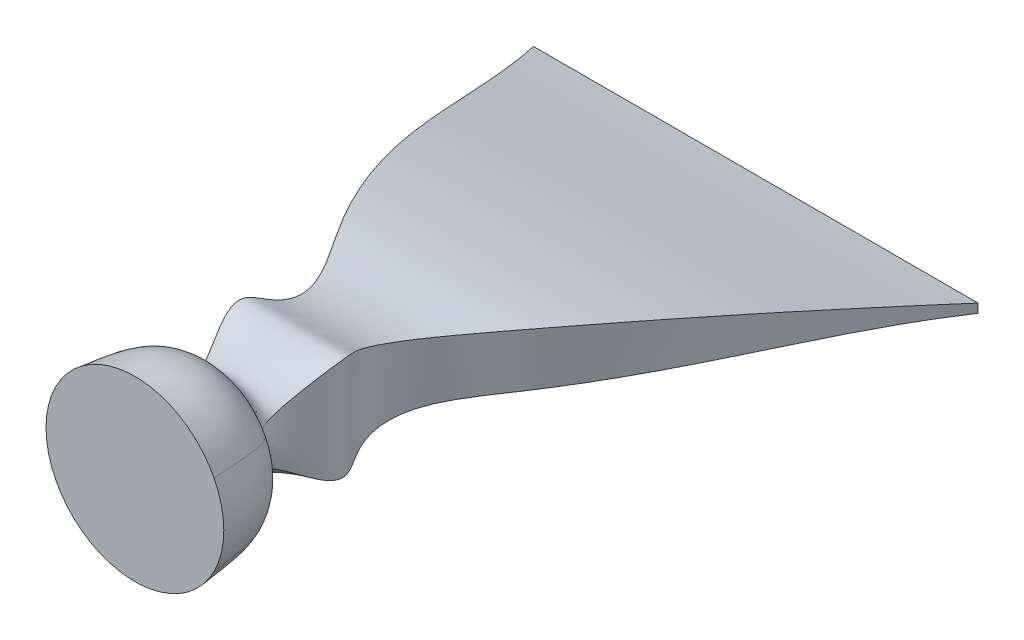
ISO-10303-21;
HEADER;
FILE_DESCRIPTION(('STEP AP214'),'2;1');
FILE_NAME('part.step','',(''),(''),'','','');
FILE_SCHEMA(('AUTOMOTIVE_DESIGN { 1 0 10303 214 1 1 1 1 }'));
ENDSEC;
DATA;
#1=APPLICATION_CONTEXT('core data for automotive mechanical design processes');
#2=APPLICATION_PROTOCOL_DEFINITION('international standard','automotive_design',2000,#1);
#3=PRODUCT_CONTEXT('',#1,'mechanical');
#4=PRODUCT('Part','Part','',(#3));
#5=PRODUCT_RELATED_PRODUCT_CATEGORY('part','',(#4));
#6=PRODUCT_DEFINITION_FORMATION('','',#4);
#7=PRODUCT_DEFINITION_CONTEXT('part definition',#1,'design');
#8=PRODUCT_DEFINITION('design','',#6,#7);
#9=PRODUCT_DEFINITION_SHAPE('','',#8);
#10=(LENGTH_UNIT() NAMED_UNIT(*) SI_UNIT(.MILLI.,.METRE.));
#11=(NAMED_UNIT(*) PLANE_ANGLE_UNIT() SI_UNIT($,.RADIAN.));
#12=(NAMED_UNIT(*) SI_UNIT($,.STERADIAN.) SOLID_ANGLE_UNIT());
#13=UNCERTAINTY_MEASURE_WITH_UNIT(LENGTH_MEASURE(1.E-05),#10,'distance_accuracy_value','');
#14=(GEOMETRIC_REPRESENTATION_CONTEXT(3) GLOBAL_UNCERTAINTY_ASSIGNED_CONTEXT((#13)) GLOBAL_UNIT_ASSIGNED_CONTEXT((#10,
#11,#12)) REPRESENTATION_CONTEXT('',''));
#15=CARTESIAN_POINT('',(0.,0.,0.));
#16=DIRECTION('',(0.,0.,1.));
#17=DIRECTION('',(1.,0.,0.));
#18=AXIS2_PLACEMENT_3D('',#15,#16,#17);
#19=CARTESIAN_POINT('',(0.,0.,700.));
#20=DIRECTION('',(0.,0.,1.));
#21=DIRECTION('',(1.,0.,0.));
#22=AXIS2_PLACEMENT_3D('',#19,#20,#21);
#23=PLANE('',#22);
#24=CARTESIAN_POINT('',(0.,0.,700.));
#25=DIRECTION('',(0.,0.,1.));
#26=DIRECTION('',(1.,0.,0.));
#27=AXIS2_PLACEMENT_3D('',#24,#25,#26);
#28=CIRCLE('',#27,100.);
#29=CARTESIAN_POINT('',(89.0953743978399,45.4094071851719,700.));
#30=VERTEX_POINT('',#29);
#31=CARTESIAN_POINT('',(-89.0953743978399,45.4094071851719,700.));
#32=VERTEX_POINT('',#31);
#33=EDGE_CURVE('E12',#30,#32,#28,.T.);
#34=ORIENTED_EDGE('',*,*,#33,.T.);
#35=CARTESIAN_POINT('',(-89.0953743978399,-45.4094071851719,700.));
#36=VERTEX_POINT('',#35);
#37=EDGE_CURVE('E161',#32,#36,#28,.T.);
#38=ORIENTED_EDGE('',*,*,#37,.T.);
#39=CARTESIAN_POINT('',(89.0953743978399,-45.4094071851719,700.));
#40=VERTEX_POINT('',#39);
#41=EDGE_CURVE('E271',#36,#40,#28,.T.);
#42=ORIENTED_EDGE('',*,*,#41,.T.);
#43=EDGE_CURVE('E264',#40,#30,#28,.T.);
#44=ORIENTED_EDGE('',*,*,#43,.T.);
#45=EDGE_LOOP('',(#34,#38,#42,#44));
#46=FACE_BOUND('',#45,.T.);
#47=ADVANCED_FACE('F151',(#46),#23,.T.);
#48=CARTESIAN_POINT('',(0.,0.,0.));
#49=DIRECTION('',(0.,0.,1.));
#50=DIRECTION('',(1.,0.,0.));
#51=AXIS2_PLACEMENT_3D('',#48,#49,#50);
#52=PLANE('',#51);
#53=DIRECTION('',(0.,1.,0.));
#54=VECTOR('',#53,1.);
#55=CARTESIAN_POINT('',(248.395230206912,-54.3960846774782,0.));
#56=LINE('',#55,#54);
#57=CARTESIAN_POINT('',(248.395230206912,-64.3960846774782,0.));
#58=VERTEX_POINT('',#57);
#59=CARTESIAN_POINT('',(248.395230206912,-54.3960846774782,0.));
#60=VERTEX_POINT('',#59);
#61=EDGE_CURVE('E259',#58,#60,#56,.T.);
#62=ORIENTED_EDGE('',*,*,#61,.F.);
#63=DIRECTION('',(1.,0.,0.));
#64=VECTOR('',#63,1.);
#65=CARTESIAN_POINT('',(-251.604769793088,-64.3960846774782,0.));
#66=LINE('',#65,#64);
#67=CARTESIAN_POINT('',(-251.604769793088,-64.3960846774782,0.));
#68=VERTEX_POINT('',#67);
#69=EDGE_CURVE('E218',#68,#58,#66,.T.);
#70=ORIENTED_EDGE('',*,*,#69,.F.);
#71=DIRECTION('',(0.,-1.,0.));
#72=VECTOR('',#71,1.);
#73=CARTESIAN_POINT('',(-251.604769793088,-54.3960846774782,0.));
#74=LINE('',#73,#72);
#75=CARTESIAN_POINT('',(-251.604769793088,-54.3960846774782,0.));
#76=VERTEX_POINT('',#75);
#77=EDGE_CURVE('E197',#76,#68,#74,.T.);
#78=ORIENTED_EDGE('',*,*,#77,.F.);
#79=DIRECTION('',(-1.,0.,0.));
#80=VECTOR('',#79,1.);
#81=CARTESIAN_POINT('',(-251.604769793088,-54.3960846774782,0.));
#82=LINE('',#81,#80);
#83=EDGE_CURVE('E203',#60,#76,#82,.T.);
#84=ORIENTED_EDGE('',*,*,#83,.F.);
#85=EDGE_LOOP('',(#62,#70,#78,#84));
#86=FACE_BOUND('',#85,.T.);
#87=ADVANCED_FACE('F217',(#86),#52,.F.);
#88=CARTESIAN_POINT('',(-251.604769793088,-54.3960846774782,0.));
#89=CARTESIAN_POINT('',(-200.538890917983,-24.0253562791996,122.651823900444));
#90=CARTESIAN_POINT('',(-176.69030179803,38.0187738864658,285.340528787873));
#91=CARTESIAN_POINT('',(-28.6581228979743,30.6660852907135,465.923919914138));
#92=CARTESIAN_POINT('',(-70.7915343498474,70.2458806099714,537.837217750563));
#93=CARTESIAN_POINT('',(-21.5246506386432,6.45099398641753,593.379747816675));
#94=CARTESIAN_POINT('',(-86.6833725542553,46.3880034508124,626.684395937186));
#95=CARTESIAN_POINT('',(-85.2345748406001,43.4416662071478,671.333333333333));
#96=CARTESIAN_POINT('',(-89.0953743978399,45.4094071851719,700.));
#97=CARTESIAN_POINT('',(-251.604769793088,-57.7294180108116,0.));
#98=CARTESIAN_POINT('',(-200.511151235237,-31.0269293373649,122.720621089058));
#99=CARTESIAN_POINT('',(-176.189787029214,16.4871557380077,285.328947273771));
#100=CARTESIAN_POINT('',(-29.0446100759519,10.2015147340967,465.92412019518));
#101=CARTESIAN_POINT('',(-70.3950520269297,23.3941875551825,537.837138285911));
#102=CARTESIAN_POINT('',(-26.6664986767681,2.76528762873666,593.379758328522));
#103=CARTESIAN_POINT('',(-99.9541435947277,17.0606235710791,626.684390801817));
#104=CARTESIAN_POINT('',(-99.772594673202,16.2292206872315,671.333333333333));
#105=CARTESIAN_POINT('',(-103.633394230442,16.8851343465728,700.));
#106=CARTESIAN_POINT('',(-251.604769793088,-61.0627513441449,0.));
#107=CARTESIAN_POINT('',(-200.483411552491,-38.0285023955303,122.789418277672));
#108=CARTESIAN_POINT('',(-176.194456806182,-4.86216825598589,285.317365759669));
#109=CARTESIAN_POINT('',(-29.044529320725,-10.4025475688819,465.924320476223));
#110=CARTESIAN_POINT('',(-70.3950840678358,-23.3144246170077,537.837058821258));
#111=CARTESIAN_POINT('',(-26.6664944382913,-2.77583893323178,593.379768840368));
#112=CARTESIAN_POINT('',(-99.9541456653573,-17.0554689259199,626.684385666449));
#113=CARTESIAN_POINT('',(-99.772594673202,-16.2292206872314,671.333333333333));
#114=CARTESIAN_POINT('',(-103.633394230442,-16.8851343465728,700.));
#115=CARTESIAN_POINT('',(-251.604769793088,-64.3960846774782,0.));
#116=CARTESIAN_POINT('',(-200.455671869745,-45.0300754536956,122.858215466287));
#117=CARTESIAN_POINT('',(-176.704311128937,-26.3937864044439,285.305784245566));
#118=CARTESIAN_POINT('',(-28.6578806322936,-30.8671181254987,465.924520757266));
#119=CARTESIAN_POINT('',(-70.7916304725655,-70.1661176717967,537.836979356605));
#120=CARTESIAN_POINT('',(-21.524637923213,-6.46154529091265,593.379779352214));
#121=CARTESIAN_POINT('',(-86.6833787661441,-46.3828488056532,626.68438053108));
#122=CARTESIAN_POINT('',(-85.2345748406001,-43.4416662071478,671.333333333333));
#123=CARTESIAN_POINT('',(-89.0953743978399,-45.4094071851719,700.));
#124=B_SPLINE_SURFACE_WITH_KNOTS('',3,3,((#88,#89,#90,#91,#92,#93,#94,#95,#96),(#97,#98,#99,
#100,#101,#102,#103,#104,#105),(#106,#107,#108,#109,#110,#111,#112,#113,#114),(#115,#116,#117,
#118,#119,#120,#121,#122,#123)),.UNSPECIFIED.,.F.,.F.,.F.,(4,4),(4,1,1,1,1,1,4),(0.,1.),(0.,
0.52434860753842,0.706694064419427,0.735740670910827,0.847013598208506,0.889298989492965,1.),.UNSPECIFIED.);
#125=CARTESIAN_POINT('',(-251.604769793088,-64.3960846774782,0.));
#126=CARTESIAN_POINT('',(-200.455671869745,-45.0300754536956,122.858215466287));
#127=CARTESIAN_POINT('',(-176.704311128937,-26.3937864044439,285.305784245566));
#128=CARTESIAN_POINT('',(-28.6578806322936,-30.8671181254987,465.924520757266));
#129=CARTESIAN_POINT('',(-70.7916304725655,-70.1661176717967,537.836979356605));
#130=CARTESIAN_POINT('',(-21.524637923213,-6.46154529091265,593.379779352214));
#131=CARTESIAN_POINT('',(-86.6833787661441,-46.3828488056532,626.68438053108));
#132=CARTESIAN_POINT('',(-85.2345748406001,-43.4416662071478,671.333333333333));
#133=CARTESIAN_POINT('',(-89.0953743978399,-45.4094071851719,700.));
#134=B_SPLINE_CURVE_WITH_KNOTS('',3,(#125,#126,#127,#128,#129,#130,#131,#132,#133),
.UNSPECIFIED.,.F.,.F.,(4,1,1,1,1,1,4),(0.,0.52434860753842,0.706694064419427,0.735740670910827,
0.847013598208506,0.889298989492965,1.),.UNSPECIFIED.);
#135=EDGE_CURVE('E202',#68,#36,#134,.T.);
#136=CARTESIAN_POINT('',(-251.604769793088,-54.3960846774782,0.));
#137=CARTESIAN_POINT('',(-200.538890917983,-24.0253562791996,122.651823900444));
#138=CARTESIAN_POINT('',(-176.69030179803,38.0187738864658,285.340528787873));
#139=CARTESIAN_POINT('',(-28.6581228979743,30.6660852907135,465.923919914138));
#140=CARTESIAN_POINT('',(-70.7915343498474,70.2458806099714,537.837217750563));
#141=CARTESIAN_POINT('',(-21.5246506386432,6.45099398641753,593.379747816675));
#142=CARTESIAN_POINT('',(-86.6833725542553,46.3880034508124,626.684395937186));
#143=CARTESIAN_POINT('',(-85.2345748406001,43.4416662071478,671.333333333333));
#144=CARTESIAN_POINT('',(-89.0953743978399,45.4094071851719,700.));
#145=B_SPLINE_CURVE_WITH_KNOTS('',3,(#136,#137,#138,#139,#140,#141,#142,#143,#144),
.UNSPECIFIED.,.F.,.F.,(4,1,1,1,1,1,4),(0.,0.52434860753842,0.706694064419427,0.735740670910827,
0.847013598208506,0.889298989492965,1.),.UNSPECIFIED.);
#146=EDGE_CURVE('E192',#32,#76,#145,.F.);
#147=ORIENTED_EDGE('',*,*,#77,.T.);
#148=ORIENTED_EDGE('',*,*,#135,.T.);
#149=ORIENTED_EDGE('',*,*,#37,.F.);
#150=ORIENTED_EDGE('',*,*,#146,.T.);
#151=EDGE_LOOP('',(#147,#148,#149,#150));
#152=FACE_BOUND('',#151,.T.);
#153=ADVANCED_FACE('F194',(#152),#124,.T.);
#154=CARTESIAN_POINT('',(-251.604769793088,-64.3960846774782,0.));
#155=CARTESIAN_POINT('',(-200.455671869745,-45.0300754536956,122.858215466287));
#156=CARTESIAN_POINT('',(-176.704311128937,-26.3937864044439,285.305784245566));
#157=CARTESIAN_POINT('',(-28.6578806322936,-30.8671181254987,465.924520757266));
#158=CARTESIAN_POINT('',(-70.7916304725655,-70.1661176717967,537.836979356605));
#159=CARTESIAN_POINT('',(-21.5246379232131,-6.46154529091266,593.379779352214));
#160=CARTESIAN_POINT('',(-86.6833787661441,-46.3828488056532,626.68438053108));
#161=CARTESIAN_POINT('',(-85.2345748406001,-43.4416662071478,671.333333333333));
#162=CARTESIAN_POINT('',(-89.0953743978399,-45.4094071851719,700.));
#163=CARTESIAN_POINT('',(-241.188103126421,-64.3960846774782,0.));
#164=CARTESIAN_POINT('',(-192.136400840389,-45.02962909744,122.873718162528));
#165=CARTESIAN_POINT('',(-169.281695228724,-26.2497408706912,285.30317469155));
#166=CARTESIAN_POINT('',(-27.5055046035789,-30.9773981713566,465.924565724743));
#167=CARTESIAN_POINT('',(-67.7992643798685,-70.0529992923132,537.836961617995));
#168=CARTESIAN_POINT('',(-21.181198142922,-7.92842940423719,593.3797795439));
#169=CARTESIAN_POINT('',(-84.5223666249692,-50.2331890105828,626.684383841743));
#170=CARTESIAN_POINT('',(-83.1999700123846,-47.4518623306756,671.333305684225));
#171=CARTESIAN_POINT('',(-86.9615002379865,-49.5961677921699,700.));
#172=CARTESIAN_POINT('',(-220.354769793088,-64.3960846774782,0.));
#173=CARTESIAN_POINT('',(-175.497858781678,-45.0287363849287,122.904723555009));
#174=CARTESIAN_POINT('',(-154.455298626656,-25.9751139573947,285.297955583517));
#175=CARTESIAN_POINT('',(-25.1863398255672,-31.187655473115,465.924655659697));
#176=CARTESIAN_POINT('',(-61.8293157557631,-69.837330415094,537.836926140775));
#177=CARTESIAN_POINT('',(-20.302610802742,-10.7251572313936,593.379779927271));
#178=CARTESIAN_POINT('',(-79.7056580152887,-57.5802468849789,626.68439046307));
#179=CARTESIAN_POINT('',(-78.5885139579852,-55.0846401714524,671.33325038601));
#180=CARTESIAN_POINT('',(-82.1515055203114,-57.582074599887,700.));
#181=CARTESIAN_POINT('',(-189.104769793088,-64.3960846774782,0.));
#182=CARTESIAN_POINT('',(-150.546949913469,-45.0274889118498,122.948050372921));
#183=CARTESIAN_POINT('',(-132.264749540035,-25.6065559580362,285.290661583051));
#184=CARTESIAN_POINT('',(-21.6691934541959,-31.4698336417012,465.924781976227));
#185=CARTESIAN_POINT('',(-52.9137926810575,-69.5478894905531,537.836875906765));
#186=CARTESIAN_POINT('',(-18.473704536982,-14.4785390654539,593.37978899929));
#187=CARTESIAN_POINT('',(-71.1313568017382,-67.4356939003533,626.684382196977));
#188=CARTESIAN_POINT('',(-70.2910553805152,-65.3384422632673,671.333281526002));
#189=CARTESIAN_POINT('',(-73.4742816356424,-68.2975478515328,699.999999999998));
#190=CARTESIAN_POINT('',(-157.854769793088,-64.3960846774782,0.));
#191=CARTESIAN_POINT('',(-125.600904911287,-45.0263397822705,122.987961557283));
#192=CARTESIAN_POINT('',(-110.117843875992,-25.2850310845046,285.283942378467));
#193=CARTESIAN_POINT('',(-18.1180386887213,-31.7160096135482,465.924898503471));
#194=CARTESIAN_POINT('',(-44.0331619456312,-69.2953772828542,537.836829459796));
#195=CARTESIAN_POINT('',(-16.1922551530175,-17.7530414383734,593.379799601021));
#196=CARTESIAN_POINT('',(-61.3709223309922,-76.0352345209033,626.684369975423));
#197=CARTESIAN_POINT('',(-60.7527510118468,-74.2807797028546,671.33333872196));
#198=CARTESIAN_POINT('',(-63.5045654425154,-77.6453305430192,700.000000000001));
#199=CARTESIAN_POINT('',(-126.604769793088,-64.3960846774782,0.));
#200=CARTESIAN_POINT('',(-100.659864058038,-45.0253187077842,123.023425174966));
#201=CARTESIAN_POINT('',(-88.0091660770155,-25.0139872548043,285.277971209763));
#202=CARTESIAN_POINT('',(-14.5370018591368,-31.9235412960554,465.925002603478));
#203=CARTESIAN_POINT('',(-35.1831913054798,-69.0825039203009,537.836787616194));
#204=CARTESIAN_POINT('',(-13.5131427530491,-20.5135199636655,593.379816445618));
#205=CARTESIAN_POINT('',(-50.565035007194,-83.2839459810661,626.684343879226));
#206=CARTESIAN_POINT('',(-50.1308167069672,-81.8212726959797,671.333483834819));
#207=CARTESIAN_POINT('',(-52.401905565121,-85.5277969719647,699.999999999999));
#208=CARTESIAN_POINT('',(-100.563103126421,-64.3960846774782,0.));
#209=CARTESIAN_POINT('',(-79.8792746702375,-45.0245931217584,123.048625986231));
#210=CARTESIAN_POINT('',(-69.6118620654442,-24.8331429201811,285.273730116539));
#211=CARTESIAN_POINT('',(-11.5319999328334,-32.0620149931204,465.925074985907));
#212=CARTESIAN_POINT('',(-27.8295622563454,-68.9404659529376,537.836759514772));
#213=CARTESIAN_POINT('',(-11.0036821974158,-22.3554267843884,593.379807238497));
#214=CARTESIAN_POINT('',(-40.834102075569,-88.1214936151903,626.684368795857));
#215=CARTESIAN_POINT('',(-40.5207929039285,-86.8506791242429,671.333317998517));
#216=CARTESIAN_POINT('',(-42.3556568718397,-90.7841513636859,700.000000000001));
#217=CARTESIAN_POINT('',(-79.7297697930878,-64.3960846774782,0.));
#218=CARTESIAN_POINT('',(-63.2566319428673,-45.0240984751421,123.065805887136));
#219=CARTESIAN_POINT('',(-54.9078398400498,-24.717203989997,285.270837724353));
#220=CARTESIAN_POINT('',(-9.11719230236745,-32.1507939059357,465.9251252131));
#221=CARTESIAN_POINT('',(-21.95774649675,-68.8494018443257,537.836739452123));
#222=CARTESIAN_POINT('',(-8.85230828560329,-23.5363199491915,593.379812701983));
#223=CARTESIAN_POINT('',(-32.6707224631698,-91.2221712128651,626.684361688143));
#224=CARTESIAN_POINT('',(-32.4421188921561,-90.0768571590493,671.333354048174));
#225=CARTESIAN_POINT('',(-33.9119482017507,-94.1572034203661,699.999999999998));
#226=CARTESIAN_POINT('',(-64.1047697930878,-64.3960846774782,0.));
#227=CARTESIAN_POINT('',(-50.7904553964754,-45.0237725957918,123.077124219778));
#228=CARTESIAN_POINT('',(-43.8856906496785,-24.6450759781921,285.268932614798));
#229=CARTESIAN_POINT('',(-7.3014953601195,-32.206027393031,465.925157970972));
#230=CARTESIAN_POINT('',(-17.5585955038671,-68.7927465975266,537.836726575581));
#231=CARTESIAN_POINT('',(-7.17767764214324,-24.2710091610092,593.379811879663));
#232=CARTESIAN_POINT('',(-26.3867070272189,-93.1516909324806,626.684366080042));
#233=CARTESIAN_POINT('',(-26.2184241839054,-92.083071941168,671.333321640814));
#234=CARTESIAN_POINT('',(-27.4089476608953,-96.2539900585968,700.000000000001));
#235=CARTESIAN_POINT('',(-48.4797697930878,-64.3960846774782,0.));
#236=CARTESIAN_POINT('',(-38.32497363096,-45.0234938430519,123.086805766744));
#237=CARTESIAN_POINT('',(-32.868504204156,-24.5881973245642,285.2673037167));
#238=CARTESIAN_POINT('',(-5.48191344206616,-32.2495861160769,465.925185450944));
#239=CARTESIAN_POINT('',(-13.1634307197597,-68.7480665938845,537.836716115739));
#240=CARTESIAN_POINT('',(-5.45134501046012,-24.8504071300775,593.379803984737));
#241=CARTESIAN_POINT('',(-19.9719287661255,-94.6731875828708,626.684384595695));
#242=CARTESIAN_POINT('',(-19.8428435050662,-93.6656178680337,671.333202585497));
#243=CARTESIAN_POINT('',(-20.7379520311535,-97.9083922813682,700.));
#244=CARTESIAN_POINT('',(-27.6464364597545,-64.3960846774782,0.));
#245=CARTESIAN_POINT('',(-21.7050972152271,-45.0231872182421,123.097455357124));
#246=CARTESIAN_POINT('',(-18.1852198436463,-24.5332832846804,285.265510452233));
#247=CARTESIAN_POINT('',(-3.05088887541843,-32.2916450231236,465.92521682279));
#248=CARTESIAN_POINT('',(-7.30825422489207,-68.7049249456191,537.8367034364));
#249=CARTESIAN_POINT('',(-3.08415822799855,-25.4098566862513,593.379810519652));
#250=CARTESIAN_POINT('',(-11.2400508865339,-96.1423447405602,626.684373728849));
#251=CARTESIAN_POINT('',(-11.1784839280322,-95.1935817023079,671.333264914913));
#252=CARTESIAN_POINT('',(-11.6852773380591,-99.5055035682238,700.));
#253=CARTESIAN_POINT('',(-1.60476979308778,-64.3960846774782,0.));
#254=CARTESIAN_POINT('',(-0.931375410885049,-45.0229294479988,123.106408147035));
#255=CARTESIAN_POINT('',(0.156789198261593,-24.5049626022722,285.264002416294));
#256=CARTESIAN_POINT('',(-0.0027104965608509,-32.313348504159,465.925243573023));
#257=CARTESIAN_POINT('',(0.00107486260964182,-68.6826625599154,537.836692390698));
#258=CARTESIAN_POINT('',(-0.0001302650721469,-25.6985509288095,593.37982102617));
#259=CARTESIAN_POINT('',(4.48047928530775E-05,-96.9002776690002,626.68435430582));
#260=CARTESIAN_POINT('',(0.000152964416892953,-95.9824875822939,671.333380977592));
#261=CARTESIAN_POINT('',(0.000263728440402095,-100.330405535326,700.));
#262=CARTESIAN_POINT('',(24.4368968735789,-64.3960846774782,0.));
#263=CARTESIAN_POINT('',(19.8417301576506,-45.022844486361,123.109359006235));
#264=CARTESIAN_POINT('',(18.498906653932,-24.5333408244262,285.263506558694));
#265=CARTESIAN_POINT('',(3.04546251110059,-32.2916441452857,465.925251476037));
#266=CARTESIAN_POINT('',(7.31040833116332,-68.7049252184919,537.836689687447));
#267=CARTESIAN_POINT('',(3.08385002202333,-25.4098582289279,593.3798123328));
#268=CARTESIAN_POINT('',(11.240238192112,-96.1423414926972,626.684372851928));
#269=CARTESIAN_POINT('',(11.1781855555203,-95.1936019598414,671.333264842953));
#270=CARTESIAN_POINT('',(11.6847629126267,-99.5055385562853,700.));
#271=CARTESIAN_POINT('',(45.2702302069122,-64.3960846774782,0.));
#272=CARTESIAN_POINT('',(36.4603865762986,-45.0228801871897,123.10811905699));
#273=CARTESIAN_POINT('',(33.1823936770789,-24.5883006061728,285.263715776579));
#274=CARTESIAN_POINT('',(5.4764856037428,-32.2495843471844,465.925247498023));
#275=CARTESIAN_POINT('',(13.1655841041128,-68.7480672846692,537.836691497433));
#276=CARTESIAN_POINT('',(5.4510642531868,-24.8504072700244,593.379807244511));
#277=CARTESIAN_POINT('',(19.9720594483208,-94.6731871490426,626.684382998163));
#278=CARTESIAN_POINT('',(19.84289610665,-93.6656208362249,671.333202626347));
#279=CARTESIAN_POINT('',(20.738042716602,-97.908397364434,699.999999999999));
#280=CARTESIAN_POINT('',(60.8952302069123,-64.3960846774782,0.));
#281=CARTESIAN_POINT('',(48.9245976292209,-45.0229581607797,123.105410904331));
#282=CARTESIAN_POINT('',(44.1997946028052,-24.6452131000548,285.264170754181));
#283=CARTESIAN_POINT('',(7.29606339030803,-32.2060250086267,465.925240318475));
#284=CARTESIAN_POINT('',(17.5607507993005,-68.7927475520278,537.836693903005));
#285=CARTESIAN_POINT('',(7.17739094170493,-24.2710088578396,593.379816199801));
#286=CARTESIAN_POINT('',(26.3868496027269,-93.151691360071,626.684363972518));
#287=CARTESIAN_POINT('',(26.218403771399,-92.0830696712673,671.33332161645));
#288=CARTESIAN_POINT('',(27.4089124718758,-96.2539861653829,700.000000000003));
#289=CARTESIAN_POINT('',(76.5202302069123,-64.3960846774782,0.));
#290=CARTESIAN_POINT('',(61.3891574194662,-45.0230864338757,123.100955766043));
#291=CARTESIAN_POINT('',(55.2222157598633,-24.7173743446222,285.264920493851));
#292=CARTESIAN_POINT('',(9.11175578094278,-32.1507909713896,465.925227540799));
#293=CARTESIAN_POINT('',(21.9599035005829,-68.8494030013011,537.836698851966));
#294=CARTESIAN_POINT('',(8.85202340057743,-23.5363199500324,593.379818073402));
#295=CARTESIAN_POINT('',(32.6708609266875,-91.2221709693329,626.684359062935));
#296=CARTESIAN_POINT('',(32.442124673303,-90.0768591336318,671.33335405711));
#297=CARTESIAN_POINT('',(33.9119581675897,-94.157206817212,699.999999999997));
#298=CARTESIAN_POINT('',(97.3535635402456,-64.3960846774782,0.));
#299=CARTESIAN_POINT('',(78.0091998560208,-45.0233227788267,123.092747112224));
#300=CARTESIAN_POINT('',(69.926675347415,-24.833356977788,285.26630264092));
#301=CARTESIAN_POINT('',(11.5265561308786,-32.0620111384616,465.925203430454));
#302=CARTESIAN_POINT('',(27.8317219668295,-68.9404675807425,537.836708552391));
#303=CARTESIAN_POINT('',(11.0034007642879,-22.355424509152,593.37981397972));
#304=CARTESIAN_POINT('',(40.8342328336064,-88.1214979810464,626.684365502949));
#305=CARTESIAN_POINT('',(40.5208475711648,-86.8506526932109,671.333317995331));
#306=CARTESIAN_POINT('',(42.3557511240761,-90.7841057967017,700.000000000004));
#307=CARTESIAN_POINT('',(123.395230206912,-64.3960846774782,0.));
#308=CARTESIAN_POINT('',(98.7857401396927,-45.0237369322501,123.078362873986));
#309=CARTESIAN_POINT('',(88.3246616640601,-25.0142534177324,285.268722841557));
#310=CARTESIAN_POINT('',(14.5315457588237,-31.9235367812525,465.925162536997));
#311=CARTESIAN_POINT('',(35.1853562167334,-69.0825056549933,537.836724160084));
#312=CARTESIAN_POINT('',(13.512853908473,-20.5135209195124,593.379824839221));
#313=CARTESIAN_POINT('',(50.5651800080042,-83.2839436414856,626.684339779605));
#314=CARTESIAN_POINT('',(50.1307851040548,-81.8212879050204,671.333483827361));
#315=CARTESIAN_POINT('',(52.4018510971236,-85.5278231919552,699.999999999995));
#316=CARTESIAN_POINT('',(154.645230206912,-64.3960846774782,0.));
#317=CARTESIAN_POINT('',(123.720786703103,-45.0244070605779,123.055088200949));
#318=CARTESIAN_POINT('',(110.434348190059,-25.285356504105,285.272642088556));
#319=CARTESIAN_POINT('',(18.1125654201171,-31.7160039413315,465.925093921324));
#320=CARTESIAN_POINT('',(44.0353334911999,-69.2953795621483,537.836751924646));
#321=CARTESIAN_POINT('',(16.1919691457615,-17.7530405349976,593.379809858549));
#322=CARTESIAN_POINT('',(61.3710600766685,-76.0352359130825,626.684364962837));
#323=CARTESIAN_POINT('',(60.7527670758952,-74.2807719802265,671.333338733812));
#324=CARTESIAN_POINT('',(63.5045930751725,-77.6453172479815,700.000000000003));
#325=CARTESIAN_POINT('',(185.895230206912,-64.3960846774782,0.));
#326=CARTESIAN_POINT('',(148.659854013891,-45.0252323996266,123.026422801043));
#327=CARTESIAN_POINT('',(132.582428690219,-25.606935793303,285.277468146027));
#328=CARTESIAN_POINT('',(21.6636997255579,-31.4698270973859,465.925010132453));
#329=CARTESIAN_POINT('',(52.9159724367441,-69.5478920715152,537.836785382237));
#330=CARTESIAN_POINT('',(18.4734155120875,-14.4785390505342,593.379800973296));
#331=CARTESIAN_POINT('',(71.1314990732198,-67.4356933918243,626.684376348683));
#332=CARTESIAN_POINT('',(70.2910466601236,-65.3384464526382,671.333281514749));
#333=CARTESIAN_POINT('',(73.4742668209344,-68.2975549785835,699.999999999998));
#334=CARTESIAN_POINT('',(217.145230206912,-64.3960846774782,0.));
#335=CARTESIAN_POINT('',(173.603017695181,-45.0261829444672,122.993408795434));
#336=CARTESIAN_POINT('',(154.774281515702,-25.9755438302361,285.283026058235));
#337=CARTESIAN_POINT('',(25.1808236318549,-31.1876480247262,465.924913838497));
#338=CARTESIAN_POINT('',(61.8315043728914,-69.8373333797073,537.836823704248));
#339=CARTESIAN_POINT('',(20.3023216926297,-10.725156643552,593.379793478525));
#340=CARTESIAN_POINT('',(79.7057986111046,-57.5802474812912,626.684383841887));
#341=CARTESIAN_POINT('',(78.5885191851443,-55.0846376607348,671.333250393864));
#342=CARTESIAN_POINT('',(82.151513730796,-57.5820706500935,700.000000000001));
#343=CARTESIAN_POINT('',(237.978563540246,-64.3960846774782,0.));
#344=CARTESIAN_POINT('',(190.235901278383,-45.0269036078659,122.968378955205));
#345=CARTESIAN_POINT('',(169.601630729737,-26.250199683635,285.287239224872));
#346=CARTESIAN_POINT('',(27.499971900193,-30.9773902398037,465.924841299424));
#347=CARTESIAN_POINT('',(67.8014595706338,-70.0530024374955,537.836852279398));
#348=CARTESIAN_POINT('',(21.1809076783466,-7.92842902556697,593.379794007774));
#349=CARTESIAN_POINT('',(84.52250864852,-50.2331891365129,626.684376775362));
#350=CARTESIAN_POINT('',(83.1999690179428,-47.4518628103677,671.333305686843));
#351=CARTESIAN_POINT('',(86.9615002379865,-49.59616779217,700.));
#352=CARTESIAN_POINT('',(248.395230206912,-64.3960846774782,0.));
#353=CARTESIAN_POINT('',(198.552343069984,-45.0272639395653,122.955864035091));
#354=CARTESIAN_POINT('',(177.024722904175,-26.3942597027168,285.289345808191));
#355=CARTESIAN_POINT('',(28.6523396983722,-30.8671099406732,465.924805029887));
#356=CARTESIAN_POINT('',(70.7938289252226,-70.1661209192549,537.836866566973));
#357=CARTESIAN_POINT('',(21.5243471046458,-6.4615448613282,593.379794272399));
#358=CARTESIAN_POINT('',(86.6835208401901,-46.3828490155188,626.684373242099));
#359=CARTESIAN_POINT('',(85.2345748406001,-43.4416662071478,671.333333333333));
#360=CARTESIAN_POINT('',(89.0953743978399,-45.4094071851719,700.));
#361=B_SPLINE_SURFACE_WITH_KNOTS('',3,3,((#154,#155,#156,#157,#158,#159,#160,#161,#162),(#163,
#164,#165,#166,#167,#168,#169,#170,#171),(#172,#173,#174,#175,#176,#177,#178,#179,#180),(#181,
#182,#183,#184,#185,#186,#187,#188,#189),(#190,#191,#192,#193,#194,#195,#196,#197,#198),(#199,
#200,#201,#202,#203,#204,#205,#206,#207),(#208,#209,#210,#211,#212,#213,#214,#215,#216),(#217,
#218,#219,#220,#221,#222,#223,#224,#225),(#226,#227,#228,#229,#230,#231,#232,#233,#234),(#235,
#236,#237,#238,#239,#240,#241,#242,#243),(#244,#245,#246,#247,#248,#249,#250,#251,#252),(#253,
#254,#255,#256,#257,#258,#259,#260,#261),(#262,#263,#264,#265,#266,#267,#268,#269,#270),(#271,
#272,#273,#274,#275,#276,#277,#278,#279),(#280,#281,#282,#283,#284,#285,#286,#287,#288),(#289,
#290,#291,#292,#293,#294,#295,#296,#297),(#298,#299,#300,#301,#302,#303,#304,#305,#306),(#307,
#308,#309,#310,#311,#312,#313,#314,#315),(#316,#317,#318,#319,#320,#321,#322,#323,#324),(#325,
#326,#327,#328,#329,#330,#331,#332,#333),(#334,#335,#336,#337,#338,#339,#340,#341,#342),(#343,
#344,#345,#346,#347,#348,#349,#350,#351),(#352,#353,#354,#355,#356,#357,#358,#359,#360)),
.UNSPECIFIED.,.F.,.F.,.F.,(4,1,1,1,1,1,1,1,1,1,1,1,1,1,1,1,1,1,1,1,4),(4,1,1,1,1,1,4),(0.,
0.0625,0.125,0.1875,0.25,0.3125,0.34375,0.375,0.40625,0.4375,0.5,0.5625,0.59375,0.625,0.65625,
0.6875,0.75,0.8125,0.875,0.9375,1.),(0.,0.52434860753842,0.706694064419427,0.735740670910827,
0.847013598208506,0.889298989492965,1.),.UNSPECIFIED.);
#362=CARTESIAN_POINT('',(248.395230206912,-64.3960846774782,0.));
#363=CARTESIAN_POINT('',(198.552343069984,-45.0272639395653,122.955864035091));
#364=CARTESIAN_POINT('',(177.024722904175,-26.3942597027168,285.289345808191));
#365=CARTESIAN_POINT('',(28.6523396983722,-30.8671099406732,465.924805029887));
#366=CARTESIAN_POINT('',(70.7938289252226,-70.1661209192549,537.836866566973));
#367=CARTESIAN_POINT('',(21.5243471046458,-6.4615448613282,593.379794272399));
#368=CARTESIAN_POINT('',(86.6835208401901,-46.3828490155188,626.684373242099));
#369=CARTESIAN_POINT('',(85.2345748406001,-43.4416662071478,671.333333333333));
#370=CARTESIAN_POINT('',(89.0953743978399,-45.4094071851719,700.));
#371=B_SPLINE_CURVE_WITH_KNOTS('',3,(#362,#363,#364,#365,#366,#367,#368,#369,#370),
.UNSPECIFIED.,.F.,.F.,(4,1,1,1,1,1,4),(0.,0.52434860753842,0.706694064419427,0.735740670910827,
0.847013598208506,0.889298989492965,1.),.UNSPECIFIED.);
#372=EDGE_CURVE('E302',#58,#40,#371,.T.);
#373=ORIENTED_EDGE('',*,*,#69,.T.);
#374=ORIENTED_EDGE('',*,*,#372,.T.);
#375=ORIENTED_EDGE('',*,*,#41,.F.);
#376=ORIENTED_EDGE('',*,*,#135,.F.);
#377=EDGE_LOOP('',(#373,#374,#375,#376));
#378=FACE_BOUND('',#377,.T.);
#379=ADVANCED_FACE('F306',(#378),#361,.T.);
#380=CARTESIAN_POINT('',(248.395230206912,-54.3960846774782,0.));
#381=CARTESIAN_POINT('',(198.635967053907,-24.0058782371364,122.74511304114));
#382=CARTESIAN_POINT('',(177.010645405246,38.015494897551,285.324824229005));
#383=CARTESIAN_POINT('',(28.6525831428937,30.6661419948121,465.924191495677));
#384=CARTESIAN_POINT('',(70.7937323347808,70.2458581117287,537.837109996318));
#385=CARTESIAN_POINT('',(21.5243598819479,6.45099696255928,593.379762070762));
#386=CARTESIAN_POINT('',(86.6835145980748,46.3880019968733,626.684388973615));
#387=CARTESIAN_POINT('',(85.2345748406001,43.4416662071478,671.333333333333));
#388=CARTESIAN_POINT('',(89.0953743978399,45.4094071851719,700.));
#389=CARTESIAN_POINT('',(237.978563540246,-54.3960846774782,0.));
#390=CARTESIAN_POINT('',(190.3170175776,-24.0038362926791,122.754892835389));
#391=CARTESIAN_POINT('',(169.587975373879,37.8710304761899,285.323178084562));
#392=CARTESIAN_POINT('',(27.5002080502781,30.7764292845628,465.924219802753));
#393=CARTESIAN_POINT('',(67.8013658706719,70.1327368581169,537.837098867984));
#394=CARTESIAN_POINT('',(21.1809201507885,7.91788145608299,593.379761388019));
#395=CARTESIAN_POINT('',(84.5225024328975,50.2383420160636,626.684392711464));
#396=CARTESIAN_POINT('',(83.1999700123847,47.4518623306757,671.333305684225));
#397=CARTESIAN_POINT('',(86.9615002379865,49.59616779217,700.));
#398=CARTESIAN_POINT('',(217.145230206912,-54.3960846774782,0.));
#399=CARTESIAN_POINT('',(173.679118624986,-23.9997524037645,122.774452423889));
#400=CARTESIAN_POINT('',(154.761470509504,37.5955657876768,285.319885795675));
#401=CARTESIAN_POINT('',(25.1810451444644,30.9867010741069,465.924276416905));
#402=CARTESIAN_POINT('',(61.8314165037425,69.9170622326409,537.837076611316));
#403=CARTESIAN_POINT('',(20.3023329088717,10.7146100436377,593.379760022532));
#404=CARTESIAN_POINT('',(79.7057937752125,57.5853995189811,626.684400187163));
#405=CARTESIAN_POINT('',(78.5885139579851,55.0846401714526,671.33325038601));
#406=CARTESIAN_POINT('',(82.1515055203112,57.5820745998873,700.));
#407=CARTESIAN_POINT('',(185.895230206912,-54.3960846774782,0.));
#408=CARTESIAN_POINT('',(148.727166015822,-23.994420726273,122.799988235448));
#409=CARTESIAN_POINT('',(132.5710971292,37.2259002354278,285.315586783741));
#410=CARTESIAN_POINT('',(21.6638957345747,31.2688983957887,465.924350940601));
#411=CARTESIAN_POINT('',(52.9158946346168,69.6276137088082,537.837046926927));
#412=CARTESIAN_POINT('',(18.4734264836336,14.4679928829575,593.379766376179));
#413=CARTESIAN_POINT('',(71.1314926395719,67.4408460432546,626.68439324908));
#414=CARTESIAN_POINT('',(70.2910553805152,65.3384422632672,671.333281526003));
#415=CARTESIAN_POINT('',(73.4742816356427,68.2975478515325,699.999999999999));
#416=CARTESIAN_POINT('',(154.645230206912,-54.3960846774782,0.));
#417=CARTESIAN_POINT('',(123.778431293522,-23.9898364747485,122.821944286476));
#418=CARTESIAN_POINT('',(110.42464426028,36.9034101882394,285.311890197292));
#419=CARTESIAN_POINT('',(18.112733138839,31.5150910585437,465.924415197209));
#420=CARTESIAN_POINT('',(44.0352670059698,69.375094878729,537.837021219155));
#421=CARTESIAN_POINT('',(16.191976688694,17.7424961319073,593.37977423446));
#422=CARTESIAN_POINT('',(61.3710583696003,76.040386235836,626.684382367789));
#423=CARTESIAN_POINT('',(60.7527510118467,74.2807797028547,671.333338721959));
#424=CARTESIAN_POINT('',(63.5045654425152,77.6453305430194,700.));
#425=CARTESIAN_POINT('',(123.395230206912,-54.3960846774782,0.));
#426=CARTESIAN_POINT('',(98.8328309244911,-23.9861704742252,122.83950241873));
#427=CARTESIAN_POINT('',(88.3167340231383,36.6315773230216,285.308933288853));
#428=CARTESIAN_POINT('',(14.5316830356805,31.7226363859728,465.924467171114));
#429=CARTESIAN_POINT('',(35.1853016323175,69.1622161023384,537.837000057404));
#430=CARTESIAN_POINT('',(13.5128635920559,20.5029753733595,593.379788343194));
#431=CARTESIAN_POINT('',(50.5651713861472,83.2890973461323,626.684357608147));
#432=CARTESIAN_POINT('',(50.1308167069672,81.8212726959796,671.333483834819));
#433=CARTESIAN_POINT('',(52.401905565121,85.5277969719647,700.));
#434=CARTESIAN_POINT('',(97.3535635402456,-54.3960846774782,0.));
#435=CARTESIAN_POINT('',(78.0468800109551,-23.9839610995236,122.85008411204));
#436=CARTESIAN_POINT('',(69.9203325860349,36.4502389087748,285.307153219461));
#437=CARTESIAN_POINT('',(11.5266655010072,31.8611186272386,465.92449699465));
#438=CARTESIAN_POINT('',(27.8316787760493,69.0201747449291,537.836988841892));
#439=CARTESIAN_POINT('',(11.0034022172097,22.344882642529,593.379776902349));
#440=CARTESIAN_POINT('',(40.8342388547336,88.1266447611759,626.684383616022));
#441=CARTESIAN_POINT('',(40.5207929039284,86.850679124243,671.333317998518));
#442=CARTESIAN_POINT('',(42.3556568718396,90.784151363686,700.));
#443=CARTESIAN_POINT('',(76.5202302069123,-54.3960846774782,0.));
#444=CARTESIAN_POINT('',(61.4190162402439,-23.9827465263882,122.855901251347));
#445=CARTESIAN_POINT('',(55.2171892859033,36.3340122436839,285.30617366683));
#446=CARTESIAN_POINT('',(9.11184267114111,31.9499025159014,465.924514142792));
#447=CARTESIAN_POINT('',(21.9598690470549,68.9291086620715,537.836981903876));
#448=CARTESIAN_POINT('',(8.85202750764944,23.5257760684918,593.379780629666));
#449=CARTESIAN_POINT('',(32.6708596320593,91.227322231266,626.684377356482));
#450=CARTESIAN_POINT('',(32.4421188921561,90.0768571590492,671.333354048175));
#451=CARTESIAN_POINT('',(33.9119482017506,94.157203420366,699.999999999999));
#452=CARTESIAN_POINT('',(60.8952302069123,-54.3960846774782,0.));
#453=CARTESIAN_POINT('',(48.9484679959271,-23.9821199509508,122.858902204109));
#454=CARTESIAN_POINT('',(44.1957760395755,36.2617238929353,285.305668728624));
#455=CARTESIAN_POINT('',(7.29613300209087,32.0051387757647,465.924522687269));
#456=CARTESIAN_POINT('',(17.5607231037309,68.8724523151331,537.83697863438));
#457=CARTESIAN_POINT('',(7.1773961962171,24.2604654258396,593.379778536494));
#458=CARTESIAN_POINT('',(26.3868445224339,93.1568418797856,626.684382369232));
#459=CARTESIAN_POINT('',(26.2184241839053,92.0830719411682,671.333321640813));
#460=CARTESIAN_POINT('',(27.4089476608953,96.253990058597,700.000000000001));
#461=CARTESIAN_POINT('',(45.2702302069123,-54.3960846774782,0.));
#462=CARTESIAN_POINT('',(36.4781703597287,-23.981784632696,122.860508194679));
#463=CARTESIAN_POINT('',(33.1794003113999,36.2047418648523,285.305399292623));
#464=CARTESIAN_POINT('',(5.47653706416811,32.0486992864821,465.924526657838));
#465=CARTESIAN_POINT('',(13.1655638822271,68.8277716022043,537.836977502263));
#466=CARTESIAN_POINT('',(5.45106282869439,24.8398634887346,593.379769407666));
#467=CARTESIAN_POINT('',(19.9720666208214,94.6783384843384,626.684401487686));
#468=CARTESIAN_POINT('',(19.8428435050662,93.6656178680336,671.333202585498));
#469=CARTESIAN_POINT('',(20.7379520311535,97.9083922813681,700.000000000001));
#470=CARTESIAN_POINT('',(24.4368968735789,-54.3960846774782,0.));
#471=CARTESIAN_POINT('',(19.8513024238751,-23.9817319776123,122.860760383656));
#472=CARTESIAN_POINT('',(18.4972929232419,36.149767342771,285.305356356235));
#473=CARTESIAN_POINT('',(3.04549214394248,32.0907592394575,465.92452776097));
#474=CARTESIAN_POINT('',(7.31039546296157,68.7846295389502,537.836976832512));
#475=CARTESIAN_POINT('',(3.08387497796553,25.3993130998045,593.379774353913));
#476=CARTESIAN_POINT('',(11.2401892631121,96.1474956152092,626.684391396953));
#477=CARTESIAN_POINT('',(11.1784839280322,95.193581702308,671.333264914912));
#478=CARTESIAN_POINT('',(11.6852773380591,99.505503568224,699.999999999999));
#479=CARTESIAN_POINT('',(-1.60476979308773,-54.3960846774782,0.));
#480=CARTESIAN_POINT('',(-0.932180491645756,-23.9824135157024,122.857496189925));
#481=CARTESIAN_POINT('',(0.156927094509485,36.1215179986456,285.305904962016));
#482=CARTESIAN_POINT('',(-0.00271465127281331,32.1124614868281,465.924518945357));
#483=CARTESIAN_POINT('',(0.00107765009659047,68.7623676427223,537.836979898118));
#484=CARTESIAN_POINT('',(-0.000154476406920357,25.6880072776132,593.379782993741));
#485=CARTESIAN_POINT('',(9.43004037384376E-05,96.9054285752816,626.684372885862));
#486=CARTESIAN_POINT('',(-0.000152964416924,95.9824875822938,671.333380977593));
#487=CARTESIAN_POINT('',(-0.000263728440428115,100.330405535325,700.));
#488=CARTESIAN_POINT('',(-27.6464364597544,-54.3960846774782,0.));
#489=CARTESIAN_POINT('',(-21.7162447171145,-23.9840889092015,122.849471973768));
#490=CARTESIAN_POINT('',(-18.1833455497323,36.1501639586156,285.307256679769));
#491=CARTESIAN_POINT('',(-3.05091956156398,32.0907524979204,465.924494897943));
#492=CARTESIAN_POINT('',(-7.30824316058712,68.7846321383378,537.836989871702));
#493=CARTESIAN_POINT('',(-3.08413643792725,25.399314334722,593.379772623437));
#494=CARTESIAN_POINT('',(-11.240098268906,96.1474925176963,626.684392251205));
#495=CARTESIAN_POINT('',(-11.1781855555203,95.1936019598415,671.333264842954));
#496=CARTESIAN_POINT('',(-11.6847629126268,99.5055385562854,700.));
#497=CARTESIAN_POINT('',(-48.4797697930878,-54.3960846774782,0.));
#498=CARTESIAN_POINT('',(-38.3442640891551,-23.9860058065879,122.840291086417));
#499=CARTESIAN_POINT('',(-32.8652563867161,36.2054524462906,285.308802697725));
#500=CARTESIAN_POINT('',(-5.48196991145467,32.048687015453,465.924467802425));
#501=CARTESIAN_POINT('',(-13.1634081187947,68.8277764598768,537.837000853921));
#502=CARTESIAN_POINT('',(-5.45135209970042,24.8398630774719,593.379766321815));
#503=CARTESIAN_POINT('',(-19.9719188262169,94.6783383197935,626.684402990191));
#504=CARTESIAN_POINT('',(-19.8428961066499,93.6656208362248,671.333202626346));
#505=CARTESIAN_POINT('',(-20.7380427166019,97.9083973644339,699.999999999999));
#506=CARTESIAN_POINT('',(-64.1047697930878,-54.3960846774782,0.));
#507=CARTESIAN_POINT('',(-50.815761507525,-23.9877235301668,122.832064132389));
#508=CARTESIAN_POINT('',(-43.8814307049911,36.2626672329335,285.310186726022));
#509=CARTESIAN_POINT('',(-7.3015689099458,32.0051224492965,465.92444455665));
#510=CARTESIAN_POINT('',(-17.5585663978172,68.8724588013673,537.837009634022));
#511=CARTESIAN_POINT('',(-7.1776799015366,24.2604643909141,593.379774433861));
#512=CARTESIAN_POINT('',(-26.3867084367319,93.1568426648617,626.684384376497));
#513=CARTESIAN_POINT('',(-26.2184037713991,92.0830696712673,671.33332161645));
#514=CARTESIAN_POINT('',(-27.408912471876,96.253986165383,700.000000000003));
#515=CARTESIAN_POINT('',(-79.7297697930878,-54.3960846774782,0.));
#516=CARTESIAN_POINT('',(-63.2878370562942,-23.9897117581943,122.822541610382));
#517=CARTESIAN_POINT('',(-54.902586637916,36.3351847753105,285.311789523457));
#518=CARTESIAN_POINT('',(-9.11728318031113,31.9498822505423,465.924417026904));
#519=CARTESIAN_POINT('',(-21.9577104179725,68.9291166953195,537.837020436098));
#520=CARTESIAN_POINT('',(-8.85231350877722,23.5257751597166,593.379775533193));
#521=CARTESIAN_POINT('',(-32.6707191996785,91.22732243211,626.68437984517));
#522=CARTESIAN_POINT('',(-32.442124673303,90.0768591336318,671.33335405711));
#523=CARTESIAN_POINT('',(-33.9119581675896,94.157206817212,699.999999999997));
#524=CARTESIAN_POINT('',(-100.563103126421,-54.3960846774783,0.));
#525=CARTESIAN_POINT('',(-79.9181588309568,-23.9927079981216,122.808191264119));
#526=CARTESIAN_POINT('',(-69.6053157724992,36.4517115909947,285.314205580474));
#527=CARTESIAN_POINT('',(-11.5321134552569,31.8610930069759,465.924375036983));
#528=CARTESIAN_POINT('',(-27.8295170110009,69.0201850085796,537.837037230526));
#529=CARTESIAN_POINT('',(-11.0036924431161,22.3448792249144,593.379770501092));
#530=CARTESIAN_POINT('',(-40.8340903392958,88.1266496851198,626.68438674363));
#531=CARTESIAN_POINT('',(-40.5208475711649,86.8506526932111,671.333317995332));
#532=CARTESIAN_POINT('',(-42.3557511240762,90.7841057967019,700.000000000005));
#533=CARTESIAN_POINT('',(-126.604769793088,-54.3960846774783,0.));
#534=CARTESIAN_POINT('',(-100.707941393908,-23.9970694443203,122.787302328427));
#535=CARTESIAN_POINT('',(-88.001072846245,36.6334119689412,285.317720800351));
#536=CARTESIAN_POINT('',(-14.5371416338689,31.7226047471337,465.924315207177));
#537=CARTESIAN_POINT('',(-35.1831359653216,69.1622285989187,537.837060351513));
#538=CARTESIAN_POINT('',(-13.5131476106516,20.5029749055885,593.37978036671));
#539=CARTESIAN_POINT('',(-50.5650365252231,83.2890957020338,626.68436150583));
#540=CARTESIAN_POINT('',(-50.1307851040548,81.8212879050202,671.33348382736));
#541=CARTESIAN_POINT('',(-52.4018510971235,85.5278231919552,699.999999999995));
#542=CARTESIAN_POINT('',(-157.854769793088,-54.3960846774782,0.));
#543=CARTESIAN_POINT('',(-125.659225196786,-24.0031682664147,122.758092314884));
#544=CARTESIAN_POINT('',(-110.108025949241,36.9056545596504,285.322639219427));
#545=CARTESIAN_POINT('',(-18.1182085646991,31.5150522015754,465.924229312655));
#546=CARTESIAN_POINT('',(-44.033094484856,69.3751103245951,537.83709497173));
#547=CARTESIAN_POINT('',(-16.1922653289042,17.7424934868139,593.37976447915));
#548=CARTESIAN_POINT('',(-61.3709153818584,76.0403884788993,626.684387132105));
#549=CARTESIAN_POINT('',(-60.7527670758954,74.2807719802265,671.333338733813));
#550=CARTESIAN_POINT('',(-63.5045930751726,77.6453172479815,700.000000000003));
#551=CARTESIAN_POINT('',(-189.104769793088,-54.3960846774782,0.));
#552=CARTESIAN_POINT('',(-150.61459204963,-24.0100061372329,122.725342663212));
#553=CARTESIAN_POINT('',(-132.253362538204,37.2285238953593,285.328152831439));
#554=CARTESIAN_POINT('',(-21.6693903210509,31.2688530486417,465.92413363379));
#555=CARTESIAN_POINT('',(-52.9137146035052,69.6276316854038,537.837133146863));
#556=CARTESIAN_POINT('',(-18.4737141857141,14.4679908314526,593.379754969844));
#557=CARTESIAN_POINT('',(-71.1313531617294,67.4408465296616,626.684398822821));
#558=CARTESIAN_POINT('',(-70.2910466601234,65.3384464526383,671.333281514748));
#559=CARTESIAN_POINT('',(-73.4742668209343,68.2975549785836,699.999999999998));
#560=CARTESIAN_POINT('',(-220.354769793088,-54.3960846774782,0.));
#561=CARTESIAN_POINT('',(-175.573924097798,-24.0174136141426,122.689864910706));
#562=CARTESIAN_POINT('',(-154.442493534892,37.5985389454091,285.334125497797));
#563=CARTESIAN_POINT('',(-25.1865612963843,30.9866496442711,465.924030167421));
#564=CARTESIAN_POINT('',(-61.8292278642723,69.9170826475849,537.837174314642));
#565=CARTESIAN_POINT('',(-20.302622836697,10.714607147409,593.379747098626));
#566=CARTESIAN_POINT('',(-79.7056514927262,57.5854012430133,626.684406499931));
#567=CARTESIAN_POINT('',(-78.5885191851446,55.0846376607348,671.333250393865));
#568=CARTESIAN_POINT('',(-82.1515137307962,57.5820706500934,700.000000000001));
#569=CARTESIAN_POINT('',(-241.188103126421,-54.3960846774782,0.));
#570=CARTESIAN_POINT('',(-192.217235311255,-24.0227087241806,122.664504237198));
#571=CARTESIAN_POINT('',(-169.268087332037,37.874207511192,285.338394357847));
#572=CARTESIAN_POINT('',(-27.5057399214375,30.7763743463455,465.923956665233));
#573=CARTESIAN_POINT('',(-67.7991710175106,70.1327586539324,537.837203271923));
#574=CARTESIAN_POINT('',(-21.1812104157007,7.91787861024548,593.379747577325));
#575=CARTESIAN_POINT('',(-84.5223607517706,50.2383433472827,626.684399458101));
#576=CARTESIAN_POINT('',(-83.1999690179428,47.4518628103677,671.333305686843));
#577=CARTESIAN_POINT('',(-86.9615002379865,49.5961677921699,700.));
#578=CARTESIAN_POINT('',(-251.604769793088,-54.3960846774782,0.));
#579=CARTESIAN_POINT('',(-200.538890917983,-24.0253562791996,122.651823900444));
#580=CARTESIAN_POINT('',(-176.69030179803,38.0187738864658,285.340528787873));
#581=CARTESIAN_POINT('',(-28.6581228979743,30.6660852907135,465.923919914138));
#582=CARTESIAN_POINT('',(-70.7915343498474,70.2458806099714,537.837217750563));
#583=CARTESIAN_POINT('',(-21.5246506386432,6.45099398641754,593.379747816675));
#584=CARTESIAN_POINT('',(-86.6833725542553,46.3880034508124,626.684395937186));
#585=CARTESIAN_POINT('',(-85.2345748406001,43.4416662071478,671.333333333333));
#586=CARTESIAN_POINT('',(-89.0953743978399,45.4094071851719,700.));
#587=B_SPLINE_SURFACE_WITH_KNOTS('',3,3,((#380,#381,#382,#383,#384,#385,#386,#387,#388),(#389,
#390,#391,#392,#393,#394,#395,#396,#397),(#398,#399,#400,#401,#402,#403,#404,#405,#406),(#407,
#408,#409,#410,#411,#412,#413,#414,#415),(#416,#417,#418,#419,#420,#421,#422,#423,#424),(#425,
#426,#427,#428,#429,#430,#431,#432,#433),(#434,#435,#436,#437,#438,#439,#440,#441,#442),(#443,
#444,#445,#446,#447,#448,#449,#450,#451),(#452,#453,#454,#455,#456,#457,#458,#459,#460),(#461,
#462,#463,#464,#465,#466,#467,#468,#469),(#470,#471,#472,#473,#474,#475,#476,#477,#478),(#479,
#480,#481,#482,#483,#484,#485,#486,#487),(#488,#489,#490,#491,#492,#493,#494,#495,#496),(#497,
#498,#499,#500,#501,#502,#503,#504,#505),(#506,#507,#508,#509,#510,#511,#512,#513,#514),(#515,
#516,#517,#518,#519,#520,#521,#522,#523),(#524,#525,#526,#527,#528,#529,#530,#531,#532),(#533,
#534,#535,#536,#537,#538,#539,#540,#541),(#542,#543,#544,#545,#546,#547,#548,#549,#550),(#551,
#552,#553,#554,#555,#556,#557,#558,#559),(#560,#561,#562,#563,#564,#565,#566,#567,#568),(#569,
#570,#571,#572,#573,#574,#575,#576,#577),(#578,#579,#580,#581,#582,#583,#584,#585,#586)),
.UNSPECIFIED.,.F.,.F.,.F.,(4,1,1,1,1,1,1,1,1,1,1,1,1,1,1,1,1,1,1,1,4),(4,1,1,1,1,1,4),(0.,
0.0625,0.125,0.1875,0.25,0.3125,0.34375,0.375,0.40625,0.4375,0.5,0.5625,0.59375,0.625,0.65625,
0.6875,0.75,0.8125,0.875,0.9375,1.),(0.,0.52434860753842,0.706694064419427,0.735740670910827,
0.847013598208506,0.889298989492965,1.),.UNSPECIFIED.);
#588=CARTESIAN_POINT('',(248.395230206912,-54.3960846774782,0.));
#589=CARTESIAN_POINT('',(198.635967053907,-24.0058782371365,122.74511304114));
#590=CARTESIAN_POINT('',(177.010645405246,38.015494897551,285.324824229005));
#591=CARTESIAN_POINT('',(28.6525831428937,30.6661419948121,465.924191495677));
#592=CARTESIAN_POINT('',(70.7937323347808,70.2458581117287,537.837109996318));
#593=CARTESIAN_POINT('',(21.5243598819479,6.45099696255927,593.379762070762));
#594=CARTESIAN_POINT('',(86.6835145980748,46.3880019968733,626.684388973615));
#595=CARTESIAN_POINT('',(85.2345748406001,43.4416662071478,671.333333333333));
#596=CARTESIAN_POINT('',(89.0953743978399,45.4094071851719,700.));
#597=B_SPLINE_CURVE_WITH_KNOTS('',3,(#588,#589,#590,#591,#592,#593,#594,#595,#596),
.UNSPECIFIED.,.F.,.F.,(4,1,1,1,1,1,4),(0.,0.52434860753842,0.706694064419427,0.735740670910827,
0.847013598208506,0.889298989492965,1.),.UNSPECIFIED.);
#598=EDGE_CURVE('E208',#60,#30,#597,.T.);
#599=ORIENTED_EDGE('',*,*,#83,.T.);
#600=ORIENTED_EDGE('',*,*,#146,.F.);
#601=ORIENTED_EDGE('',*,*,#33,.F.);
#602=ORIENTED_EDGE('',*,*,#598,.F.);
#603=EDGE_LOOP('',(#599,#600,#601,#602));
#604=FACE_BOUND('',#603,.T.);
#605=ADVANCED_FACE('F207',(#604),#587,.T.);
#606=CARTESIAN_POINT('',(248.395230206912,-64.3960846774782,0.));
#607=CARTESIAN_POINT('',(198.552343069984,-45.0272639395653,122.955864035091));
#608=CARTESIAN_POINT('',(177.024722904175,-26.3942597027168,285.289345808191));
#609=CARTESIAN_POINT('',(28.6523396983722,-30.8671099406732,465.924805029887));
#610=CARTESIAN_POINT('',(70.7938289252226,-70.1661209192549,537.836866566973));
#611=CARTESIAN_POINT('',(21.5243471046458,-6.46154486132819,593.379794272399));
#612=CARTESIAN_POINT('',(86.6835208401901,-46.3828490155188,626.684373242099));
#613=CARTESIAN_POINT('',(85.2345748406001,-43.4416662071478,671.333333333333));
#614=CARTESIAN_POINT('',(89.0953743978399,-45.4094071851719,700.));
#615=CARTESIAN_POINT('',(248.395230206912,-61.0627513441449,0.));
#616=CARTESIAN_POINT('',(198.580217731291,-38.020135372089,122.885613703774));
#617=CARTESIAN_POINT('',(176.514845858746,-4.86357678447272,285.301171948462));
#618=CARTESIAN_POINT('',(29.0389887797506,-10.4025232109654,465.924600518484));
#619=CARTESIAN_POINT('',(70.397282364585,-23.3144342813941,537.836947710088));
#620=CARTESIAN_POINT('',(26.6662036403481,-2.77583765479489,593.37978353852));
#621=CARTESIAN_POINT('',(99.9542877293278,-17.0554695504767,626.684378485938));
#622=CARTESIAN_POINT('',(99.772594673202,-16.2292206872315,671.333333333333));
#623=CARTESIAN_POINT('',(103.633394230442,-16.8851343465728,700.));
#624=CARTESIAN_POINT('',(248.395230206912,-57.7294180108116,0.));
#625=CARTESIAN_POINT('',(198.608092392599,-31.0130068046127,122.815363372457));
#626=CARTESIAN_POINT('',(176.510153359103,16.4848119793069,285.312998088734));
#627=CARTESIAN_POINT('',(29.0390699279244,10.2015552651042,465.92439600708));
#628=CARTESIAN_POINT('',(70.3972501677711,23.3941714738679,537.837028853203));
#629=CARTESIAN_POINT('',(26.6662078994488,2.76528975602596,593.379772804641));
#630=CARTESIAN_POINT('',(99.9542856486227,17.0606225318312,626.684383729776));
#631=CARTESIAN_POINT('',(99.772594673202,16.2292206872314,671.333333333333));
#632=CARTESIAN_POINT('',(103.633394230442,16.8851343465728,700.));
#633=CARTESIAN_POINT('',(248.395230206912,-54.3960846774782,0.));
#634=CARTESIAN_POINT('',(198.635967053907,-24.0058782371365,122.74511304114));
#635=CARTESIAN_POINT('',(177.010645405246,38.015494897551,285.324824229005));
#636=CARTESIAN_POINT('',(28.6525831428937,30.6661419948121,465.924191495677));
#637=CARTESIAN_POINT('',(70.7937323347808,70.2458581117287,537.837109996318));
#638=CARTESIAN_POINT('',(21.5243598819479,6.45099696255927,593.379762070762));
#639=CARTESIAN_POINT('',(86.6835145980748,46.3880019968733,626.684388973615));
#640=CARTESIAN_POINT('',(85.2345748406001,43.4416662071478,671.333333333333));
#641=CARTESIAN_POINT('',(89.0953743978399,45.4094071851719,700.));
#642=B_SPLINE_SURFACE_WITH_KNOTS('',3,3,((#606,#607,#608,#609,#610,#611,#612,#613,#614),(#615,
#616,#617,#618,#619,#620,#621,#622,#623),(#624,#625,#626,#627,#628,#629,#630,#631,#632),(#633,
#634,#635,#636,#637,#638,#639,#640,#641)),.UNSPECIFIED.,.F.,.F.,.F.,(4,4),(4,1,1,1,1,1,4),(0.,
1.),(0.,0.52434860753842,0.706694064419427,0.735740670910827,0.847013598208506,
0.889298989492965,1.),.UNSPECIFIED.);
#643=ORIENTED_EDGE('',*,*,#61,.T.);
#644=ORIENTED_EDGE('',*,*,#598,.T.);
#645=ORIENTED_EDGE('',*,*,#43,.F.);
#646=ORIENTED_EDGE('',*,*,#372,.F.);
#647=EDGE_LOOP('',(#643,#644,#645,#646));
#648=FACE_BOUND('',#647,.T.);
#649=ADVANCED_FACE('F301',(#648),#642,.T.);
#650=CLOSED_SHELL('',(#47,#87,#153,#379,#605,#649));
#651=MANIFOLD_SOLID_BREP('B2',#650);
#652=ADVANCED_BREP_SHAPE_REPRESENTATION('',(#18,#651),#14);
#653=SHAPE_DEFINITION_REPRESENTATION(#9,#652);
ENDSEC;
END-ISO-10303-21;
